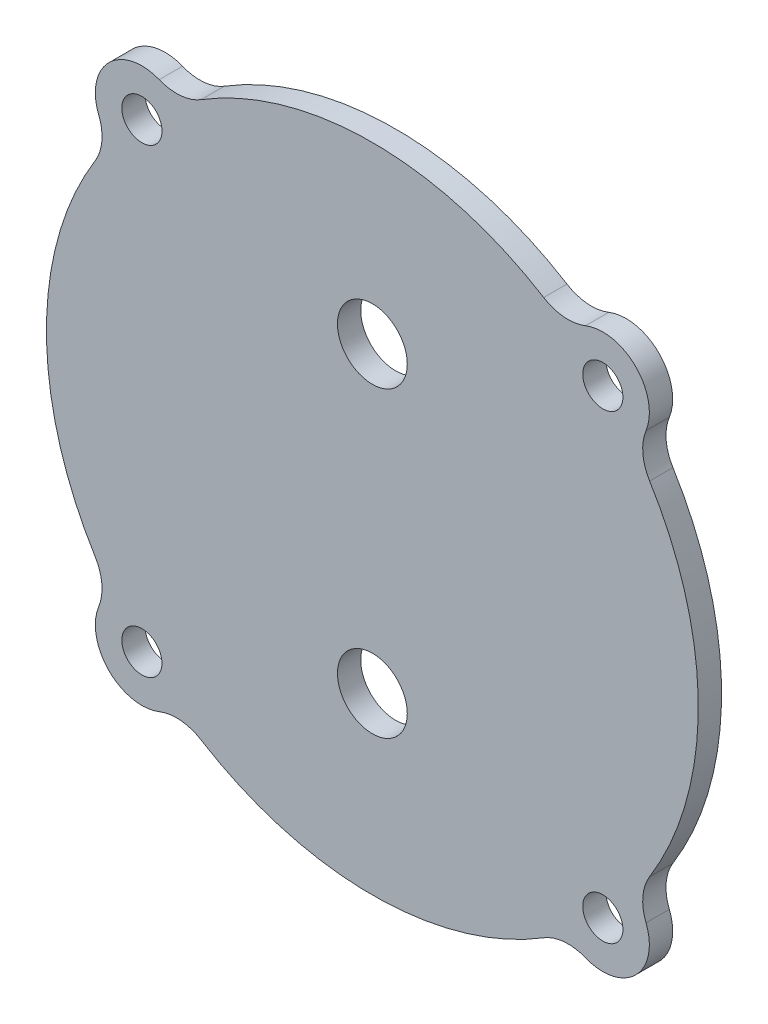
ISO-10303-21;
HEADER;
FILE_DESCRIPTION(('STEP AP214'),'2;1');
FILE_NAME('part.step','',(''),(''),'','','');
FILE_SCHEMA(('AUTOMOTIVE_DESIGN { 1 0 10303 214 1 1 1 1 }'));
ENDSEC;
DATA;
#1=APPLICATION_CONTEXT('core data for automotive mechanical design processes');
#2=APPLICATION_PROTOCOL_DEFINITION('international standard','automotive_design',2000,#1);
#3=PRODUCT_CONTEXT('',#1,'mechanical');
#4=PRODUCT('Part','Part','',(#3));
#5=PRODUCT_RELATED_PRODUCT_CATEGORY('part','',(#4));
#6=PRODUCT_DEFINITION_FORMATION('','',#4);
#7=PRODUCT_DEFINITION_CONTEXT('part definition',#1,'design');
#8=PRODUCT_DEFINITION('design','',#6,#7);
#9=PRODUCT_DEFINITION_SHAPE('','',#8);
#10=(LENGTH_UNIT() NAMED_UNIT(*) SI_UNIT(.MILLI.,.METRE.));
#11=(NAMED_UNIT(*) PLANE_ANGLE_UNIT() SI_UNIT($,.RADIAN.));
#12=(NAMED_UNIT(*) SI_UNIT($,.STERADIAN.) SOLID_ANGLE_UNIT());
#13=UNCERTAINTY_MEASURE_WITH_UNIT(LENGTH_MEASURE(1.E-05),#10,'distance_accuracy_value','');
#14=(GEOMETRIC_REPRESENTATION_CONTEXT(3) GLOBAL_UNCERTAINTY_ASSIGNED_CONTEXT((#13)) GLOBAL_UNIT_ASSIGNED_CONTEXT((#10,
#11,#12)) REPRESENTATION_CONTEXT('',''));
#15=CARTESIAN_POINT('',(0.,0.,0.));
#16=DIRECTION('',(0.,0.,1.));
#17=DIRECTION('',(1.,0.,0.));
#18=AXIS2_PLACEMENT_3D('',#15,#16,#17);
#19=CARTESIAN_POINT('',(-9.89949493661171,-9.89949493661162,2.));
#20=DIRECTION('',(0.,0.,1.));
#21=DIRECTION('',(1.,0.,0.));
#22=AXIS2_PLACEMENT_3D('',#19,#20,#21);
#23=PLANE('',#22);
#24=CARTESIAN_POINT('',(0.,13.,2.));
#25=DIRECTION('',(0.,0.,1.));
#26=DIRECTION('',(1.,0.,0.));
#27=AXIS2_PLACEMENT_3D('',#24,#25,#26);
#28=CIRCLE('',#27,3.);
#29=CARTESIAN_POINT('',(3.,13.,2.));
#30=VERTEX_POINT('',#29);
#31=EDGE_CURVE('E550',#30,#30,#28,.T.);
#32=ORIENTED_EDGE('',*,*,#31,.F.);
#33=EDGE_LOOP('',(#32));
#34=FACE_BOUND('',#33,.T.);
#35=CARTESIAN_POINT('',(-19.7989898732234,-19.7989898732232,2.));
#36=DIRECTION('',(0.,0.,1.));
#37=DIRECTION('',(1.,0.,0.));
#38=AXIS2_PLACEMENT_3D('',#35,#36,#37);
#39=CIRCLE('',#38,1.725);
#40=CARTESIAN_POINT('',(-18.0739898732234,-19.7989898732232,2.));
#41=VERTEX_POINT('',#40);
#42=EDGE_CURVE('E521',#41,#41,#39,.T.);
#43=ORIENTED_EDGE('',*,*,#42,.F.);
#44=EDGE_LOOP('',(#43));
#45=FACE_BOUND('',#44,.T.);
#46=CARTESIAN_POINT('',(19.7989898732234,19.7989898732232,2.));
#47=DIRECTION('',(0.,0.,1.));
#48=DIRECTION('',(1.,0.,0.));
#49=AXIS2_PLACEMENT_3D('',#46,#47,#48);
#50=CIRCLE('',#49,1.725);
#51=CARTESIAN_POINT('',(21.5239898732234,19.7989898732232,2.));
#52=VERTEX_POINT('',#51);
#53=EDGE_CURVE('E266',#52,#52,#50,.T.);
#54=ORIENTED_EDGE('',*,*,#53,.F.);
#55=EDGE_LOOP('',(#54));
#56=FACE_BOUND('',#55,.T.);
#57=CARTESIAN_POINT('',(-19.7989898732234,19.7989898732232,2.));
#58=DIRECTION('',(0.,0.,1.));
#59=DIRECTION('',(1.,0.,0.));
#60=AXIS2_PLACEMENT_3D('',#57,#58,#59);
#61=CIRCLE('',#60,4.);
#62=CARTESIAN_POINT('',(-18.3091374642261,23.5111778802354,2.));
#63=VERTEX_POINT('',#62);
#64=CARTESIAN_POINT('',(-23.5111778802356,18.3091374642259,2.));
#65=VERTEX_POINT('',#64);
#66=EDGE_CURVE('E180',#63,#65,#61,.T.);
#67=ORIENTED_EDGE('',*,*,#66,.T.);
#68=CARTESIAN_POINT('',(-27.2233658872477,16.8192850552286,2.));
#69=DIRECTION('',(0.,0.,1.));
#70=DIRECTION('',(1.,0.,0.));
#71=AXIS2_PLACEMENT_3D('',#68,#69,#70);
#72=CIRCLE('',#71,4.);
#73=CARTESIAN_POINT('',(-23.8204451513418,14.716874423325,2.));
#74=VERTEX_POINT('',#73);
#75=EDGE_CURVE('E237',#65,#74,#72,.F.);
#76=ORIENTED_EDGE('',*,*,#75,.T.);
#77=CARTESIAN_POINT('',(0.,0.,2.));
#78=DIRECTION('',(0.,0.,1.));
#79=DIRECTION('',(1.,0.,0.));
#80=AXIS2_PLACEMENT_3D('',#77,#78,#79);
#81=CIRCLE('',#80,28.);
#82=CARTESIAN_POINT('',(-23.8204451513418,-14.716874423325,2.));
#83=VERTEX_POINT('',#82);
#84=EDGE_CURVE('E174',#74,#83,#81,.T.);
#85=ORIENTED_EDGE('',*,*,#84,.T.);
#86=CARTESIAN_POINT('',(-27.2233658872477,-16.8192850552286,2.));
#87=DIRECTION('',(0.,0.,1.));
#88=DIRECTION('',(1.,0.,0.));
#89=AXIS2_PLACEMENT_3D('',#86,#87,#88);
#90=CIRCLE('',#89,4.);
#91=CARTESIAN_POINT('',(-23.5111778802356,-18.3091374642259,2.));
#92=VERTEX_POINT('',#91);
#93=EDGE_CURVE('E233',#83,#92,#90,.F.);
#94=ORIENTED_EDGE('',*,*,#93,.T.);
#95=CARTESIAN_POINT('',(-19.7989898732234,-19.7989898732232,2.));
#96=DIRECTION('',(0.,0.,1.));
#97=DIRECTION('',(1.,0.,0.));
#98=AXIS2_PLACEMENT_3D('',#95,#96,#97);
#99=CIRCLE('',#98,4.);
#100=CARTESIAN_POINT('',(-18.3091374642261,-23.5111778802354,2.));
#101=VERTEX_POINT('',#100);
#102=EDGE_CURVE('E249',#92,#101,#99,.T.);
#103=ORIENTED_EDGE('',*,*,#102,.T.);
#104=CARTESIAN_POINT('',(-16.8192850552289,-27.2233658872476,2.));
#105=DIRECTION('',(0.,0.,1.));
#106=DIRECTION('',(1.,0.,0.));
#107=AXIS2_PLACEMENT_3D('',#104,#105,#106);
#108=CIRCLE('',#107,4.);
#109=CARTESIAN_POINT('',(-14.7168744233253,-23.8204451513416,2.));
#110=VERTEX_POINT('',#109);
#111=EDGE_CURVE('E229',#101,#110,#108,.F.);
#112=ORIENTED_EDGE('',*,*,#111,.T.);
#113=CARTESIAN_POINT('',(0.,0.,2.));
#114=DIRECTION('',(0.,0.,1.));
#115=DIRECTION('',(1.,0.,0.));
#116=AXIS2_PLACEMENT_3D('',#113,#114,#115);
#117=CIRCLE('',#116,28.);
#118=CARTESIAN_POINT('',(14.7168744233253,-23.8204451513416,2.));
#119=VERTEX_POINT('',#118);
#120=EDGE_CURVE('E340',#110,#119,#117,.T.);
#121=ORIENTED_EDGE('',*,*,#120,.T.);
#122=CARTESIAN_POINT('',(16.8192850552289,-27.2233658872476,2.));
#123=DIRECTION('',(0.,0.,1.));
#124=DIRECTION('',(1.,0.,0.));
#125=AXIS2_PLACEMENT_3D('',#122,#123,#124);
#126=CIRCLE('',#125,4.);
#127=CARTESIAN_POINT('',(18.3091374642262,-23.5111778802354,2.));
#128=VERTEX_POINT('',#127);
#129=EDGE_CURVE('E225',#119,#128,#126,.F.);
#130=ORIENTED_EDGE('',*,*,#129,.T.);
#131=CARTESIAN_POINT('',(19.7989898732234,-19.7989898732232,2.));
#132=DIRECTION('',(0.,0.,1.));
#133=DIRECTION('',(1.,0.,0.));
#134=AXIS2_PLACEMENT_3D('',#131,#132,#133);
#135=CIRCLE('',#134,4.);
#136=CARTESIAN_POINT('',(23.5111778802356,-18.3091374642259,2.));
#137=VERTEX_POINT('',#136);
#138=EDGE_CURVE('E343',#128,#137,#135,.T.);
#139=ORIENTED_EDGE('',*,*,#138,.T.);
#140=CARTESIAN_POINT('',(27.2233658872478,-16.8192850552286,2.));
#141=DIRECTION('',(0.,0.,1.));
#142=DIRECTION('',(1.,0.,0.));
#143=AXIS2_PLACEMENT_3D('',#140,#141,#142);
#144=CIRCLE('',#143,4.);
#145=CARTESIAN_POINT('',(23.8204451513418,-14.716874423325,2.));
#146=VERTEX_POINT('',#145);
#147=EDGE_CURVE('E221',#137,#146,#144,.F.);
#148=ORIENTED_EDGE('',*,*,#147,.T.);
#149=CARTESIAN_POINT('',(0.,0.,2.));
#150=DIRECTION('',(0.,0.,1.));
#151=DIRECTION('',(1.,0.,0.));
#152=AXIS2_PLACEMENT_3D('',#149,#150,#151);
#153=CIRCLE('',#152,28.);
#154=CARTESIAN_POINT('',(23.8204451513418,14.716874423325,2.));
#155=VERTEX_POINT('',#154);
#156=EDGE_CURVE('E260',#146,#155,#153,.T.);
#157=ORIENTED_EDGE('',*,*,#156,.T.);
#158=CARTESIAN_POINT('',(27.2233658872478,16.8192850552286,2.));
#159=DIRECTION('',(0.,0.,1.));
#160=DIRECTION('',(1.,0.,0.));
#161=AXIS2_PLACEMENT_3D('',#158,#159,#160);
#162=CIRCLE('',#161,4.);
#163=CARTESIAN_POINT('',(23.5111778802356,18.3091374642259,2.));
#164=VERTEX_POINT('',#163);
#165=EDGE_CURVE('E217',#155,#164,#162,.F.);
#166=ORIENTED_EDGE('',*,*,#165,.T.);
#167=CARTESIAN_POINT('',(19.7989898732234,19.7989898732232,2.));
#168=DIRECTION('',(0.,0.,1.));
#169=DIRECTION('',(1.,0.,0.));
#170=AXIS2_PLACEMENT_3D('',#167,#168,#169);
#171=CIRCLE('',#170,4.);
#172=CARTESIAN_POINT('',(18.3091374642262,23.5111778802354,2.));
#173=VERTEX_POINT('',#172);
#174=EDGE_CURVE('E257',#164,#173,#171,.T.);
#175=ORIENTED_EDGE('',*,*,#174,.T.);
#176=CARTESIAN_POINT('',(16.8192850552289,27.2233658872476,2.));
#177=DIRECTION('',(0.,0.,1.));
#178=DIRECTION('',(1.,0.,0.));
#179=AXIS2_PLACEMENT_3D('',#176,#177,#178);
#180=CIRCLE('',#179,4.);
#181=CARTESIAN_POINT('',(14.7168744233253,23.8204451513416,2.));
#182=VERTEX_POINT('',#181);
#183=EDGE_CURVE('E155',#173,#182,#180,.F.);
#184=ORIENTED_EDGE('',*,*,#183,.T.);
#185=CARTESIAN_POINT('',(0.,0.,2.));
#186=DIRECTION('',(0.,0.,1.));
#187=DIRECTION('',(1.,0.,0.));
#188=AXIS2_PLACEMENT_3D('',#185,#186,#187);
#189=CIRCLE('',#188,28.);
#190=CARTESIAN_POINT('',(-14.7168744233253,23.8204451513416,2.));
#191=VERTEX_POINT('',#190);
#192=EDGE_CURVE('E163',#182,#191,#189,.T.);
#193=ORIENTED_EDGE('',*,*,#192,.T.);
#194=CARTESIAN_POINT('',(-16.8192850552289,27.2233658872476,2.));
#195=DIRECTION('',(0.,0.,1.));
#196=DIRECTION('',(1.,0.,0.));
#197=AXIS2_PLACEMENT_3D('',#194,#195,#196);
#198=CIRCLE('',#197,4.);
#199=EDGE_CURVE('E11',#191,#63,#198,.F.);
#200=ORIENTED_EDGE('',*,*,#199,.T.);
#201=EDGE_LOOP('',(#67,#76,#85,#94,#103,#112,#121,#130,#139,#148,#157,#166,#175,#184,#193,#200));
#202=FACE_BOUND('',#201,.T.);
#203=CARTESIAN_POINT('',(-19.7989898732234,19.7989898732232,2.));
#204=DIRECTION('',(0.,0.,1.));
#205=DIRECTION('',(1.,0.,0.));
#206=AXIS2_PLACEMENT_3D('',#203,#204,#205);
#207=CIRCLE('',#206,1.725);
#208=CARTESIAN_POINT('',(-18.0739898732234,19.7989898732232,2.));
#209=VERTEX_POINT('',#208);
#210=EDGE_CURVE('E330',#209,#209,#207,.T.);
#211=ORIENTED_EDGE('',*,*,#210,.F.);
#212=EDGE_LOOP('',(#211));
#213=FACE_BOUND('',#212,.T.);
#214=CARTESIAN_POINT('',(19.7989898732234,-19.7989898732232,2.));
#215=DIRECTION('',(0.,0.,1.));
#216=DIRECTION('',(1.,0.,0.));
#217=AXIS2_PLACEMENT_3D('',#214,#215,#216);
#218=CIRCLE('',#217,1.725);
#219=CARTESIAN_POINT('',(21.5239898732234,-19.7989898732232,2.));
#220=VERTEX_POINT('',#219);
#221=EDGE_CURVE('E526',#220,#220,#218,.T.);
#222=ORIENTED_EDGE('',*,*,#221,.F.);
#223=EDGE_LOOP('',(#222));
#224=FACE_BOUND('',#223,.T.);
#225=CARTESIAN_POINT('',(0.,-13.,2.));
#226=DIRECTION('',(0.,0.,1.));
#227=DIRECTION('',(1.,0.,0.));
#228=AXIS2_PLACEMENT_3D('',#225,#226,#227);
#229=CIRCLE('',#228,3.);
#230=CARTESIAN_POINT('',(3.,-13.,2.));
#231=VERTEX_POINT('',#230);
#232=EDGE_CURVE('E544',#231,#231,#229,.T.);
#233=ORIENTED_EDGE('',*,*,#232,.F.);
#234=EDGE_LOOP('',(#233));
#235=FACE_BOUND('',#234,.T.);
#236=ADVANCED_FACE('F32',(#34,#45,#56,#202,#213,#224,#235),#23,.T.);
#237=CARTESIAN_POINT('',(-9.89949493661171,-9.89949493661162,0.));
#238=DIRECTION('',(0.,0.,1.));
#239=DIRECTION('',(1.,0.,0.));
#240=AXIS2_PLACEMENT_3D('',#237,#238,#239);
#241=PLANE('',#240);
#242=CARTESIAN_POINT('',(0.,13.,0.));
#243=DIRECTION('',(0.,0.,1.));
#244=DIRECTION('',(1.,0.,0.));
#245=AXIS2_PLACEMENT_3D('',#242,#243,#244);
#246=CIRCLE('',#245,3.);
#247=CARTESIAN_POINT('',(3.,13.,0.));
#248=VERTEX_POINT('',#247);
#249=EDGE_CURVE('E547',#248,#248,#246,.T.);
#250=ORIENTED_EDGE('',*,*,#249,.T.);
#251=EDGE_LOOP('',(#250));
#252=FACE_BOUND('',#251,.T.);
#253=CARTESIAN_POINT('',(-19.7989898732234,-19.7989898732232,0.));
#254=DIRECTION('',(0.,0.,1.));
#255=DIRECTION('',(1.,0.,0.));
#256=AXIS2_PLACEMENT_3D('',#253,#254,#255);
#257=CIRCLE('',#256,1.725);
#258=CARTESIAN_POINT('',(-18.0739898732234,-19.7989898732232,0.));
#259=VERTEX_POINT('',#258);
#260=EDGE_CURVE('E524',#259,#259,#257,.T.);
#261=ORIENTED_EDGE('',*,*,#260,.T.);
#262=EDGE_LOOP('',(#261));
#263=FACE_BOUND('',#262,.T.);
#264=CARTESIAN_POINT('',(19.7989898732234,19.7989898732232,0.));
#265=DIRECTION('',(0.,0.,1.));
#266=DIRECTION('',(1.,0.,0.));
#267=AXIS2_PLACEMENT_3D('',#264,#265,#266);
#268=CIRCLE('',#267,1.725);
#269=CARTESIAN_POINT('',(21.5239898732234,19.7989898732232,0.));
#270=VERTEX_POINT('',#269);
#271=EDGE_CURVE('E328',#270,#270,#268,.T.);
#272=ORIENTED_EDGE('',*,*,#271,.T.);
#273=EDGE_LOOP('',(#272));
#274=FACE_BOUND('',#273,.T.);
#275=CARTESIAN_POINT('',(0.,0.,0.));
#276=DIRECTION('',(0.,0.,1.));
#277=DIRECTION('',(1.,0.,0.));
#278=AXIS2_PLACEMENT_3D('',#275,#276,#277);
#279=CIRCLE('',#278,28.);
#280=CARTESIAN_POINT('',(-23.8204451513418,14.716874423325,0.));
#281=VERTEX_POINT('',#280);
#282=CARTESIAN_POINT('',(-23.8204451513418,-14.716874423325,0.));
#283=VERTEX_POINT('',#282);
#284=EDGE_CURVE('E252',#281,#283,#279,.T.);
#285=ORIENTED_EDGE('',*,*,#284,.F.);
#286=CARTESIAN_POINT('',(-27.2233658872477,16.8192850552286,0.));
#287=DIRECTION('',(0.,0.,1.));
#288=DIRECTION('',(1.,0.,0.));
#289=AXIS2_PLACEMENT_3D('',#286,#287,#288);
#290=CIRCLE('',#289,4.);
#291=CARTESIAN_POINT('',(-23.5111778802356,18.3091374642259,0.));
#292=VERTEX_POINT('',#291);
#293=EDGE_CURVE('E235',#281,#292,#290,.T.);
#294=ORIENTED_EDGE('',*,*,#293,.T.);
#295=CARTESIAN_POINT('',(-19.7989898732234,19.7989898732232,0.));
#296=DIRECTION('',(0.,0.,1.));
#297=DIRECTION('',(1.,0.,0.));
#298=AXIS2_PLACEMENT_3D('',#295,#296,#297);
#299=CIRCLE('',#298,4.);
#300=CARTESIAN_POINT('',(-18.3091374642261,23.5111778802354,0.));
#301=VERTEX_POINT('',#300);
#302=EDGE_CURVE('E171',#301,#292,#299,.T.);
#303=ORIENTED_EDGE('',*,*,#302,.F.);
#304=CARTESIAN_POINT('',(-16.8192850552289,27.2233658872476,0.));
#305=DIRECTION('',(0.,0.,1.));
#306=DIRECTION('',(1.,0.,0.));
#307=AXIS2_PLACEMENT_3D('',#304,#305,#306);
#308=CIRCLE('',#307,4.);
#309=CARTESIAN_POINT('',(-14.7168744233253,23.8204451513416,0.));
#310=VERTEX_POINT('',#309);
#311=EDGE_CURVE('E40',#301,#310,#308,.T.);
#312=ORIENTED_EDGE('',*,*,#311,.T.);
#313=CARTESIAN_POINT('',(0.,0.,0.));
#314=DIRECTION('',(0.,0.,1.));
#315=DIRECTION('',(1.,0.,0.));
#316=AXIS2_PLACEMENT_3D('',#313,#314,#315);
#317=CIRCLE('',#316,28.);
#318=CARTESIAN_POINT('',(14.7168744233253,23.8204451513416,0.));
#319=VERTEX_POINT('',#318);
#320=EDGE_CURVE('E161',#319,#310,#317,.T.);
#321=ORIENTED_EDGE('',*,*,#320,.F.);
#322=CARTESIAN_POINT('',(16.8192850552289,27.2233658872476,0.));
#323=DIRECTION('',(0.,0.,1.));
#324=DIRECTION('',(1.,0.,0.));
#325=AXIS2_PLACEMENT_3D('',#322,#323,#324);
#326=CIRCLE('',#325,4.);
#327=CARTESIAN_POINT('',(18.3091374642262,23.5111778802354,0.));
#328=VERTEX_POINT('',#327);
#329=EDGE_CURVE('E145',#319,#328,#326,.T.);
#330=ORIENTED_EDGE('',*,*,#329,.T.);
#331=CARTESIAN_POINT('',(19.7989898732234,19.7989898732232,0.));
#332=DIRECTION('',(0.,0.,1.));
#333=DIRECTION('',(1.,0.,0.));
#334=AXIS2_PLACEMENT_3D('',#331,#332,#333);
#335=CIRCLE('',#334,4.);
#336=CARTESIAN_POINT('',(23.5111778802356,18.3091374642259,0.));
#337=VERTEX_POINT('',#336);
#338=EDGE_CURVE('E172',#337,#328,#335,.T.);
#339=ORIENTED_EDGE('',*,*,#338,.F.);
#340=CARTESIAN_POINT('',(27.2233658872478,16.8192850552286,0.));
#341=DIRECTION('',(0.,0.,1.));
#342=DIRECTION('',(1.,0.,0.));
#343=AXIS2_PLACEMENT_3D('',#340,#341,#342);
#344=CIRCLE('',#343,4.);
#345=CARTESIAN_POINT('',(23.8204451513418,14.716874423325,0.));
#346=VERTEX_POINT('',#345);
#347=EDGE_CURVE('E215',#337,#346,#344,.T.);
#348=ORIENTED_EDGE('',*,*,#347,.T.);
#349=CARTESIAN_POINT('',(0.,0.,0.));
#350=DIRECTION('',(0.,0.,1.));
#351=DIRECTION('',(1.,0.,0.));
#352=AXIS2_PLACEMENT_3D('',#349,#350,#351);
#353=CIRCLE('',#352,28.);
#354=CARTESIAN_POINT('',(23.8204451513418,-14.716874423325,0.));
#355=VERTEX_POINT('',#354);
#356=EDGE_CURVE('E176',#355,#346,#353,.T.);
#357=ORIENTED_EDGE('',*,*,#356,.F.);
#358=CARTESIAN_POINT('',(27.2233658872478,-16.8192850552286,0.));
#359=DIRECTION('',(0.,0.,1.));
#360=DIRECTION('',(1.,0.,0.));
#361=AXIS2_PLACEMENT_3D('',#358,#359,#360);
#362=CIRCLE('',#361,4.);
#363=CARTESIAN_POINT('',(23.5111778802356,-18.3091374642259,0.));
#364=VERTEX_POINT('',#363);
#365=EDGE_CURVE('E219',#355,#364,#362,.T.);
#366=ORIENTED_EDGE('',*,*,#365,.T.);
#367=CARTESIAN_POINT('',(19.7989898732234,-19.7989898732232,0.));
#368=DIRECTION('',(0.,0.,1.));
#369=DIRECTION('',(1.,0.,0.));
#370=AXIS2_PLACEMENT_3D('',#367,#368,#369);
#371=CIRCLE('',#370,4.);
#372=CARTESIAN_POINT('',(18.3091374642262,-23.5111778802354,0.));
#373=VERTEX_POINT('',#372);
#374=EDGE_CURVE('E272',#373,#364,#371,.T.);
#375=ORIENTED_EDGE('',*,*,#374,.F.);
#376=CARTESIAN_POINT('',(16.8192850552289,-27.2233658872476,0.));
#377=DIRECTION('',(0.,0.,1.));
#378=DIRECTION('',(1.,0.,0.));
#379=AXIS2_PLACEMENT_3D('',#376,#377,#378);
#380=CIRCLE('',#379,4.);
#381=CARTESIAN_POINT('',(14.7168744233253,-23.8204451513416,0.));
#382=VERTEX_POINT('',#381);
#383=EDGE_CURVE('E223',#373,#382,#380,.T.);
#384=ORIENTED_EDGE('',*,*,#383,.T.);
#385=CARTESIAN_POINT('',(0.,0.,0.));
#386=DIRECTION('',(0.,0.,1.));
#387=DIRECTION('',(1.,0.,0.));
#388=AXIS2_PLACEMENT_3D('',#385,#386,#387);
#389=CIRCLE('',#388,28.);
#390=CARTESIAN_POINT('',(-14.7168744233253,-23.8204451513416,0.));
#391=VERTEX_POINT('',#390);
#392=EDGE_CURVE('E269',#391,#382,#389,.T.);
#393=ORIENTED_EDGE('',*,*,#392,.F.);
#394=CARTESIAN_POINT('',(-16.8192850552289,-27.2233658872476,0.));
#395=DIRECTION('',(0.,0.,1.));
#396=DIRECTION('',(1.,0.,0.));
#397=AXIS2_PLACEMENT_3D('',#394,#395,#396);
#398=CIRCLE('',#397,4.);
#399=CARTESIAN_POINT('',(-18.3091374642261,-23.5111778802354,0.));
#400=VERTEX_POINT('',#399);
#401=EDGE_CURVE('E227',#391,#400,#398,.T.);
#402=ORIENTED_EDGE('',*,*,#401,.T.);
#403=CARTESIAN_POINT('',(-19.7989898732234,-19.7989898732232,0.));
#404=DIRECTION('',(0.,0.,1.));
#405=DIRECTION('',(1.,0.,0.));
#406=AXIS2_PLACEMENT_3D('',#403,#404,#405);
#407=CIRCLE('',#406,4.);
#408=CARTESIAN_POINT('',(-23.5111778802356,-18.3091374642259,0.));
#409=VERTEX_POINT('',#408);
#410=EDGE_CURVE('E265',#409,#400,#407,.T.);
#411=ORIENTED_EDGE('',*,*,#410,.F.);
#412=CARTESIAN_POINT('',(-27.2233658872477,-16.8192850552286,0.));
#413=DIRECTION('',(0.,0.,1.));
#414=DIRECTION('',(1.,0.,0.));
#415=AXIS2_PLACEMENT_3D('',#412,#413,#414);
#416=CIRCLE('',#415,4.);
#417=EDGE_CURVE('E231',#409,#283,#416,.T.);
#418=ORIENTED_EDGE('',*,*,#417,.T.);
#419=EDGE_LOOP('',(#285,#294,#303,#312,#321,#330,#339,#348,#357,#366,#375,#384,#393,#402,#411,#418));
#420=FACE_BOUND('',#419,.T.);
#421=CARTESIAN_POINT('',(-19.7989898732234,19.7989898732232,0.));
#422=DIRECTION('',(0.,0.,1.));
#423=DIRECTION('',(1.,0.,0.));
#424=AXIS2_PLACEMENT_3D('',#421,#422,#423);
#425=CIRCLE('',#424,1.725);
#426=CARTESIAN_POINT('',(-18.0739898732234,19.7989898732232,0.));
#427=VERTEX_POINT('',#426);
#428=EDGE_CURVE('E334',#427,#427,#425,.T.);
#429=ORIENTED_EDGE('',*,*,#428,.T.);
#430=EDGE_LOOP('',(#429));
#431=FACE_BOUND('',#430,.T.);
#432=CARTESIAN_POINT('',(19.7989898732234,-19.7989898732232,0.));
#433=DIRECTION('',(0.,0.,1.));
#434=DIRECTION('',(1.,0.,0.));
#435=AXIS2_PLACEMENT_3D('',#432,#433,#434);
#436=CIRCLE('',#435,1.725);
#437=CARTESIAN_POINT('',(21.5239898732234,-19.7989898732232,0.));
#438=VERTEX_POINT('',#437);
#439=EDGE_CURVE('E530',#438,#438,#436,.T.);
#440=ORIENTED_EDGE('',*,*,#439,.T.);
#441=EDGE_LOOP('',(#440));
#442=FACE_BOUND('',#441,.T.);
#443=CARTESIAN_POINT('',(0.,-13.,0.));
#444=DIRECTION('',(0.,0.,1.));
#445=DIRECTION('',(1.,0.,0.));
#446=AXIS2_PLACEMENT_3D('',#443,#444,#445);
#447=CIRCLE('',#446,3.);
#448=CARTESIAN_POINT('',(3.,-13.,0.));
#449=VERTEX_POINT('',#448);
#450=EDGE_CURVE('E542',#449,#449,#447,.T.);
#451=ORIENTED_EDGE('',*,*,#450,.T.);
#452=EDGE_LOOP('',(#451));
#453=FACE_BOUND('',#452,.T.);
#454=ADVANCED_FACE('F168',(#252,#263,#274,#420,#431,#442,#453),#241,.F.);
#455=CARTESIAN_POINT('',(0.,0.,2.));
#456=DIRECTION('',(0.,0.,-1.));
#457=DIRECTION('',(-1.,0.,0.));
#458=AXIS2_PLACEMENT_3D('',#455,#456,#457);
#459=CYLINDRICAL_SURFACE('',#458,28.);
#460=ORIENTED_EDGE('',*,*,#284,.T.);
#461=DIRECTION('',(0.,0.,-1.));
#462=VECTOR('',#461,1.);
#463=CARTESIAN_POINT('',(-23.8204451513418,-14.716874423325,2.));
#464=LINE('',#463,#462);
#465=EDGE_CURVE('E208',#283,#83,#464,.F.);
#466=ORIENTED_EDGE('',*,*,#465,.T.);
#467=ORIENTED_EDGE('',*,*,#84,.F.);
#468=DIRECTION('',(0.,0.,-1.));
#469=VECTOR('',#468,1.);
#470=CARTESIAN_POINT('',(-23.8204451513418,14.716874423325,2.));
#471=LINE('',#470,#469);
#472=EDGE_CURVE('E205',#74,#281,#471,.T.);
#473=ORIENTED_EDGE('',*,*,#472,.T.);
#474=EDGE_LOOP('',(#460,#466,#467,#473));
#475=FACE_BOUND('',#474,.T.);
#476=ADVANCED_FACE('F247',(#475),#459,.T.);
#477=CARTESIAN_POINT('',(-19.7989898732234,-19.7989898732232,2.));
#478=DIRECTION('',(0.,0.,-1.));
#479=DIRECTION('',(-1.,0.,0.));
#480=AXIS2_PLACEMENT_3D('',#477,#478,#479);
#481=CYLINDRICAL_SURFACE('',#480,4.);
#482=ORIENTED_EDGE('',*,*,#410,.T.);
#483=DIRECTION('',(0.,0.,-1.));
#484=VECTOR('',#483,1.);
#485=CARTESIAN_POINT('',(-18.3091374642261,-23.5111778802354,2.));
#486=LINE('',#485,#484);
#487=EDGE_CURVE('E203',#400,#101,#486,.F.);
#488=ORIENTED_EDGE('',*,*,#487,.T.);
#489=ORIENTED_EDGE('',*,*,#102,.F.);
#490=DIRECTION('',(0.,0.,-1.));
#491=VECTOR('',#490,1.);
#492=CARTESIAN_POINT('',(-23.5111778802356,-18.3091374642259,2.));
#493=LINE('',#492,#491);
#494=EDGE_CURVE('E200',#92,#409,#493,.T.);
#495=ORIENTED_EDGE('',*,*,#494,.T.);
#496=EDGE_LOOP('',(#482,#488,#489,#495));
#497=FACE_BOUND('',#496,.T.);
#498=ADVANCED_FACE('F368',(#497),#481,.T.);
#499=CARTESIAN_POINT('',(0.,0.,2.));
#500=DIRECTION('',(0.,0.,-1.));
#501=DIRECTION('',(-1.,0.,0.));
#502=AXIS2_PLACEMENT_3D('',#499,#500,#501);
#503=CYLINDRICAL_SURFACE('',#502,28.);
#504=ORIENTED_EDGE('',*,*,#392,.T.);
#505=DIRECTION('',(0.,0.,-1.));
#506=VECTOR('',#505,1.);
#507=CARTESIAN_POINT('',(14.7168744233253,-23.8204451513416,2.));
#508=LINE('',#507,#506);
#509=EDGE_CURVE('E198',#382,#119,#508,.F.);
#510=ORIENTED_EDGE('',*,*,#509,.T.);
#511=ORIENTED_EDGE('',*,*,#120,.F.);
#512=DIRECTION('',(0.,0.,-1.));
#513=VECTOR('',#512,1.);
#514=CARTESIAN_POINT('',(-14.7168744233253,-23.8204451513416,2.));
#515=LINE('',#514,#513);
#516=EDGE_CURVE('E195',#110,#391,#515,.T.);
#517=ORIENTED_EDGE('',*,*,#516,.T.);
#518=EDGE_LOOP('',(#504,#510,#511,#517));
#519=FACE_BOUND('',#518,.T.);
#520=ADVANCED_FACE('F359',(#519),#503,.T.);
#521=CARTESIAN_POINT('',(19.7989898732234,-19.7989898732232,2.));
#522=DIRECTION('',(0.,0.,-1.));
#523=DIRECTION('',(-1.,0.,0.));
#524=AXIS2_PLACEMENT_3D('',#521,#522,#523);
#525=CYLINDRICAL_SURFACE('',#524,4.);
#526=ORIENTED_EDGE('',*,*,#374,.T.);
#527=DIRECTION('',(0.,0.,-1.));
#528=VECTOR('',#527,1.);
#529=CARTESIAN_POINT('',(23.5111778802356,-18.3091374642259,2.));
#530=LINE('',#529,#528);
#531=EDGE_CURVE('E193',#364,#137,#530,.F.);
#532=ORIENTED_EDGE('',*,*,#531,.T.);
#533=ORIENTED_EDGE('',*,*,#138,.F.);
#534=DIRECTION('',(0.,0.,-1.));
#535=VECTOR('',#534,1.);
#536=CARTESIAN_POINT('',(18.3091374642262,-23.5111778802354,2.));
#537=LINE('',#536,#535);
#538=EDGE_CURVE('E190',#128,#373,#537,.T.);
#539=ORIENTED_EDGE('',*,*,#538,.T.);
#540=EDGE_LOOP('',(#526,#532,#533,#539));
#541=FACE_BOUND('',#540,.T.);
#542=ADVANCED_FACE('F296',(#541),#525,.T.);
#543=CARTESIAN_POINT('',(0.,0.,2.));
#544=DIRECTION('',(0.,0.,-1.));
#545=DIRECTION('',(-1.,0.,0.));
#546=AXIS2_PLACEMENT_3D('',#543,#544,#545);
#547=CYLINDRICAL_SURFACE('',#546,28.);
#548=ORIENTED_EDGE('',*,*,#356,.T.);
#549=DIRECTION('',(0.,0.,-1.));
#550=VECTOR('',#549,1.);
#551=CARTESIAN_POINT('',(23.8204451513418,14.716874423325,2.));
#552=LINE('',#551,#550);
#553=EDGE_CURVE('E188',#346,#155,#552,.F.);
#554=ORIENTED_EDGE('',*,*,#553,.T.);
#555=ORIENTED_EDGE('',*,*,#156,.F.);
#556=DIRECTION('',(0.,0.,-1.));
#557=VECTOR('',#556,1.);
#558=CARTESIAN_POINT('',(23.8204451513418,-14.716874423325,2.));
#559=LINE('',#558,#557);
#560=EDGE_CURVE('E185',#146,#355,#559,.T.);
#561=ORIENTED_EDGE('',*,*,#560,.T.);
#562=EDGE_LOOP('',(#548,#554,#555,#561));
#563=FACE_BOUND('',#562,.T.);
#564=ADVANCED_FACE('F278',(#563),#547,.T.);
#565=CARTESIAN_POINT('',(19.7989898732234,19.7989898732232,2.));
#566=DIRECTION('',(0.,0.,-1.));
#567=DIRECTION('',(-1.,0.,0.));
#568=AXIS2_PLACEMENT_3D('',#565,#566,#567);
#569=CYLINDRICAL_SURFACE('',#568,4.);
#570=ORIENTED_EDGE('',*,*,#338,.T.);
#571=DIRECTION('',(0.,0.,-1.));
#572=VECTOR('',#571,1.);
#573=CARTESIAN_POINT('',(18.3091374642262,23.5111778802354,2.));
#574=LINE('',#573,#572);
#575=EDGE_CURVE('E150',#328,#173,#574,.F.);
#576=ORIENTED_EDGE('',*,*,#575,.T.);
#577=ORIENTED_EDGE('',*,*,#174,.F.);
#578=DIRECTION('',(0.,0.,-1.));
#579=VECTOR('',#578,1.);
#580=CARTESIAN_POINT('',(23.5111778802356,18.3091374642259,2.));
#581=LINE('',#580,#579);
#582=EDGE_CURVE('E164',#164,#337,#581,.T.);
#583=ORIENTED_EDGE('',*,*,#582,.T.);
#584=EDGE_LOOP('',(#570,#576,#577,#583));
#585=FACE_BOUND('',#584,.T.);
#586=ADVANCED_FACE('F288',(#585),#569,.T.);
#587=CARTESIAN_POINT('',(0.,0.,2.));
#588=DIRECTION('',(0.,0.,-1.));
#589=DIRECTION('',(-1.,0.,0.));
#590=AXIS2_PLACEMENT_3D('',#587,#588,#589);
#591=CYLINDRICAL_SURFACE('',#590,28.);
#592=ORIENTED_EDGE('',*,*,#192,.F.);
#593=DIRECTION('',(0.,0.,-1.));
#594=VECTOR('',#593,1.);
#595=CARTESIAN_POINT('',(14.7168744233253,23.8204451513416,2.));
#596=LINE('',#595,#594);
#597=EDGE_CURVE('E149',#182,#319,#596,.T.);
#598=ORIENTED_EDGE('',*,*,#597,.T.);
#599=ORIENTED_EDGE('',*,*,#320,.T.);
#600=DIRECTION('',(0.,0.,-1.));
#601=VECTOR('',#600,1.);
#602=CARTESIAN_POINT('',(-14.7168744233253,23.8204451513416,2.));
#603=LINE('',#602,#601);
#604=EDGE_CURVE('E165',#310,#191,#603,.F.);
#605=ORIENTED_EDGE('',*,*,#604,.T.);
#606=EDGE_LOOP('',(#592,#598,#599,#605));
#607=FACE_BOUND('',#606,.T.);
#608=ADVANCED_FACE('F160',(#607),#591,.T.);
#609=CARTESIAN_POINT('',(-19.7989898732234,19.7989898732232,2.));
#610=DIRECTION('',(0.,0.,-1.));
#611=DIRECTION('',(-1.,0.,0.));
#612=AXIS2_PLACEMENT_3D('',#609,#610,#611);
#613=CYLINDRICAL_SURFACE('',#612,4.);
#614=ORIENTED_EDGE('',*,*,#302,.T.);
#615=DIRECTION('',(0.,0.,-1.));
#616=VECTOR('',#615,1.);
#617=CARTESIAN_POINT('',(-23.5111778802356,18.3091374642259,2.));
#618=LINE('',#617,#616);
#619=EDGE_CURVE('E47',#292,#65,#618,.F.);
#620=ORIENTED_EDGE('',*,*,#619,.T.);
#621=ORIENTED_EDGE('',*,*,#66,.F.);
#622=DIRECTION('',(0.,0.,-1.));
#623=VECTOR('',#622,1.);
#624=CARTESIAN_POINT('',(-18.3091374642261,23.5111778802354,2.));
#625=LINE('',#624,#623);
#626=EDGE_CURVE('E210',#63,#301,#625,.T.);
#627=ORIENTED_EDGE('',*,*,#626,.T.);
#628=EDGE_LOOP('',(#614,#620,#621,#627));
#629=FACE_BOUND('',#628,.T.);
#630=ADVANCED_FACE('F253',(#629),#613,.T.);
#631=CARTESIAN_POINT('',(19.7989898732234,19.7989898732232,2.));
#632=DIRECTION('',(0.,0.,-1.));
#633=DIRECTION('',(-1.,0.,0.));
#634=AXIS2_PLACEMENT_3D('',#631,#632,#633);
#635=CYLINDRICAL_SURFACE('',#634,1.725);
#636=ORIENTED_EDGE('',*,*,#53,.T.);
#637=EDGE_LOOP('',(#636));
#638=FACE_BOUND('',#637,.T.);
#639=ORIENTED_EDGE('',*,*,#271,.F.);
#640=EDGE_LOOP('',(#639));
#641=FACE_BOUND('',#640,.T.);
#642=ADVANCED_FACE('F309',(#638,#641),#635,.F.);
#643=CARTESIAN_POINT('',(-19.7989898732234,19.7989898732232,2.));
#644=DIRECTION('',(0.,0.,-1.));
#645=DIRECTION('',(-1.,0.,0.));
#646=AXIS2_PLACEMENT_3D('',#643,#644,#645);
#647=CYLINDRICAL_SURFACE('',#646,1.725);
#648=ORIENTED_EDGE('',*,*,#210,.T.);
#649=EDGE_LOOP('',(#648));
#650=FACE_BOUND('',#649,.T.);
#651=ORIENTED_EDGE('',*,*,#428,.F.);
#652=EDGE_LOOP('',(#651));
#653=FACE_BOUND('',#652,.T.);
#654=ADVANCED_FACE('F316',(#650,#653),#647,.F.);
#655=CARTESIAN_POINT('',(-19.7989898732234,-19.7989898732232,2.));
#656=DIRECTION('',(0.,0.,-1.));
#657=DIRECTION('',(-1.,0.,0.));
#658=AXIS2_PLACEMENT_3D('',#655,#656,#657);
#659=CYLINDRICAL_SURFACE('',#658,1.725);
#660=ORIENTED_EDGE('',*,*,#42,.T.);
#661=EDGE_LOOP('',(#660));
#662=FACE_BOUND('',#661,.T.);
#663=ORIENTED_EDGE('',*,*,#260,.F.);
#664=EDGE_LOOP('',(#663));
#665=FACE_BOUND('',#664,.T.);
#666=ADVANCED_FACE('F321',(#662,#665),#659,.F.);
#667=CARTESIAN_POINT('',(19.7989898732234,-19.7989898732232,2.));
#668=DIRECTION('',(0.,0.,-1.));
#669=DIRECTION('',(-1.,0.,0.));
#670=AXIS2_PLACEMENT_3D('',#667,#668,#669);
#671=CYLINDRICAL_SURFACE('',#670,1.725);
#672=ORIENTED_EDGE('',*,*,#221,.T.);
#673=EDGE_LOOP('',(#672));
#674=FACE_BOUND('',#673,.T.);
#675=ORIENTED_EDGE('',*,*,#439,.F.);
#676=EDGE_LOOP('',(#675));
#677=FACE_BOUND('',#676,.T.);
#678=ADVANCED_FACE('F483',(#674,#677),#671,.F.);
#679=CARTESIAN_POINT('',(0.,13.,2.));
#680=DIRECTION('',(0.,0.,-1.));
#681=DIRECTION('',(-1.,0.,0.));
#682=AXIS2_PLACEMENT_3D('',#679,#680,#681);
#683=CYLINDRICAL_SURFACE('',#682,3.);
#684=ORIENTED_EDGE('',*,*,#31,.T.);
#685=EDGE_LOOP('',(#684));
#686=FACE_BOUND('',#685,.T.);
#687=ORIENTED_EDGE('',*,*,#249,.F.);
#688=EDGE_LOOP('',(#687));
#689=FACE_BOUND('',#688,.T.);
#690=ADVANCED_FACE('F476',(#686,#689),#683,.F.);
#691=CARTESIAN_POINT('',(0.,-13.,2.));
#692=DIRECTION('',(0.,0.,-1.));
#693=DIRECTION('',(-1.,0.,0.));
#694=AXIS2_PLACEMENT_3D('',#691,#692,#693);
#695=CYLINDRICAL_SURFACE('',#694,3.);
#696=ORIENTED_EDGE('',*,*,#232,.T.);
#697=EDGE_LOOP('',(#696));
#698=FACE_BOUND('',#697,.T.);
#699=ORIENTED_EDGE('',*,*,#450,.F.);
#700=EDGE_LOOP('',(#699));
#701=FACE_BOUND('',#700,.T.);
#702=ADVANCED_FACE('F389',(#698,#701),#695,.F.);
#703=CARTESIAN_POINT('',(16.8192850552289,27.2233658872476,2.));
#704=DIRECTION('',(0.,0.,1.));
#705=DIRECTION('',(1.,0.,0.));
#706=AXIS2_PLACEMENT_3D('',#703,#704,#705);
#707=CYLINDRICAL_SURFACE('',#706,4.);
#708=ORIENTED_EDGE('',*,*,#183,.F.);
#709=ORIENTED_EDGE('',*,*,#575,.F.);
#710=ORIENTED_EDGE('',*,*,#329,.F.);
#711=ORIENTED_EDGE('',*,*,#597,.F.);
#712=EDGE_LOOP('',(#708,#709,#710,#711));
#713=FACE_BOUND('',#712,.T.);
#714=ADVANCED_FACE('F148',(#713),#707,.F.);
#715=CARTESIAN_POINT('',(27.2233658872478,16.8192850552286,2.));
#716=DIRECTION('',(0.,0.,1.));
#717=DIRECTION('',(1.,0.,0.));
#718=AXIS2_PLACEMENT_3D('',#715,#716,#717);
#719=CYLINDRICAL_SURFACE('',#718,4.);
#720=ORIENTED_EDGE('',*,*,#165,.F.);
#721=ORIENTED_EDGE('',*,*,#553,.F.);
#722=ORIENTED_EDGE('',*,*,#347,.F.);
#723=ORIENTED_EDGE('',*,*,#582,.F.);
#724=EDGE_LOOP('',(#720,#721,#722,#723));
#725=FACE_BOUND('',#724,.T.);
#726=ADVANCED_FACE('F284',(#725),#719,.F.);
#727=CARTESIAN_POINT('',(27.2233658872478,-16.8192850552286,2.));
#728=DIRECTION('',(0.,0.,1.));
#729=DIRECTION('',(1.,0.,0.));
#730=AXIS2_PLACEMENT_3D('',#727,#728,#729);
#731=CYLINDRICAL_SURFACE('',#730,4.);
#732=ORIENTED_EDGE('',*,*,#147,.F.);
#733=ORIENTED_EDGE('',*,*,#531,.F.);
#734=ORIENTED_EDGE('',*,*,#365,.F.);
#735=ORIENTED_EDGE('',*,*,#560,.F.);
#736=EDGE_LOOP('',(#732,#733,#734,#735));
#737=FACE_BOUND('',#736,.T.);
#738=ADVANCED_FACE('F352',(#737),#731,.F.);
#739=CARTESIAN_POINT('',(16.8192850552289,-27.2233658872476,2.));
#740=DIRECTION('',(0.,0.,1.));
#741=DIRECTION('',(1.,0.,0.));
#742=AXIS2_PLACEMENT_3D('',#739,#740,#741);
#743=CYLINDRICAL_SURFACE('',#742,4.);
#744=ORIENTED_EDGE('',*,*,#129,.F.);
#745=ORIENTED_EDGE('',*,*,#509,.F.);
#746=ORIENTED_EDGE('',*,*,#383,.F.);
#747=ORIENTED_EDGE('',*,*,#538,.F.);
#748=EDGE_LOOP('',(#744,#745,#746,#747));
#749=FACE_BOUND('',#748,.T.);
#750=ADVANCED_FACE('F355',(#749),#743,.F.);
#751=CARTESIAN_POINT('',(-16.8192850552289,-27.2233658872476,2.));
#752=DIRECTION('',(0.,0.,1.));
#753=DIRECTION('',(1.,0.,0.));
#754=AXIS2_PLACEMENT_3D('',#751,#752,#753);
#755=CYLINDRICAL_SURFACE('',#754,4.);
#756=ORIENTED_EDGE('',*,*,#111,.F.);
#757=ORIENTED_EDGE('',*,*,#487,.F.);
#758=ORIENTED_EDGE('',*,*,#401,.F.);
#759=ORIENTED_EDGE('',*,*,#516,.F.);
#760=EDGE_LOOP('',(#756,#757,#758,#759));
#761=FACE_BOUND('',#760,.T.);
#762=ADVANCED_FACE('F364',(#761),#755,.F.);
#763=CARTESIAN_POINT('',(-27.2233658872477,-16.8192850552286,2.));
#764=DIRECTION('',(0.,0.,1.));
#765=DIRECTION('',(1.,0.,0.));
#766=AXIS2_PLACEMENT_3D('',#763,#764,#765);
#767=CYLINDRICAL_SURFACE('',#766,4.);
#768=ORIENTED_EDGE('',*,*,#93,.F.);
#769=ORIENTED_EDGE('',*,*,#465,.F.);
#770=ORIENTED_EDGE('',*,*,#417,.F.);
#771=ORIENTED_EDGE('',*,*,#494,.F.);
#772=EDGE_LOOP('',(#768,#769,#770,#771));
#773=FACE_BOUND('',#772,.T.);
#774=ADVANCED_FACE('F372',(#773),#767,.F.);
#775=CARTESIAN_POINT('',(-27.2233658872477,16.8192850552286,2.));
#776=DIRECTION('',(0.,0.,1.));
#777=DIRECTION('',(1.,0.,0.));
#778=AXIS2_PLACEMENT_3D('',#775,#776,#777);
#779=CYLINDRICAL_SURFACE('',#778,4.);
#780=ORIENTED_EDGE('',*,*,#75,.F.);
#781=ORIENTED_EDGE('',*,*,#619,.F.);
#782=ORIENTED_EDGE('',*,*,#293,.F.);
#783=ORIENTED_EDGE('',*,*,#472,.F.);
#784=EDGE_LOOP('',(#780,#781,#782,#783));
#785=FACE_BOUND('',#784,.T.);
#786=ADVANCED_FACE('F251',(#785),#779,.F.);
#787=CARTESIAN_POINT('',(-16.8192850552289,27.2233658872476,2.));
#788=DIRECTION('',(0.,0.,1.));
#789=DIRECTION('',(1.,0.,0.));
#790=AXIS2_PLACEMENT_3D('',#787,#788,#789);
#791=CYLINDRICAL_SURFACE('',#790,4.);
#792=ORIENTED_EDGE('',*,*,#199,.F.);
#793=ORIENTED_EDGE('',*,*,#604,.F.);
#794=ORIENTED_EDGE('',*,*,#311,.F.);
#795=ORIENTED_EDGE('',*,*,#626,.F.);
#796=EDGE_LOOP('',(#792,#793,#794,#795));
#797=FACE_BOUND('',#796,.T.);
#798=ADVANCED_FACE('F34',(#797),#791,.F.);
#799=CLOSED_SHELL('',(#236,#454,#476,#498,#520,#542,#564,#586,#608,#630,#642,#654,#666,#678,
#690,#702,#714,#726,#738,#750,#762,#774,#786,#798));
#800=MANIFOLD_SOLID_BREP('B2',#799);
#801=ADVANCED_BREP_SHAPE_REPRESENTATION('',(#18,#800),#14);
#802=SHAPE_DEFINITION_REPRESENTATION(#9,#801);
ENDSEC;
END-ISO-10303-21;
